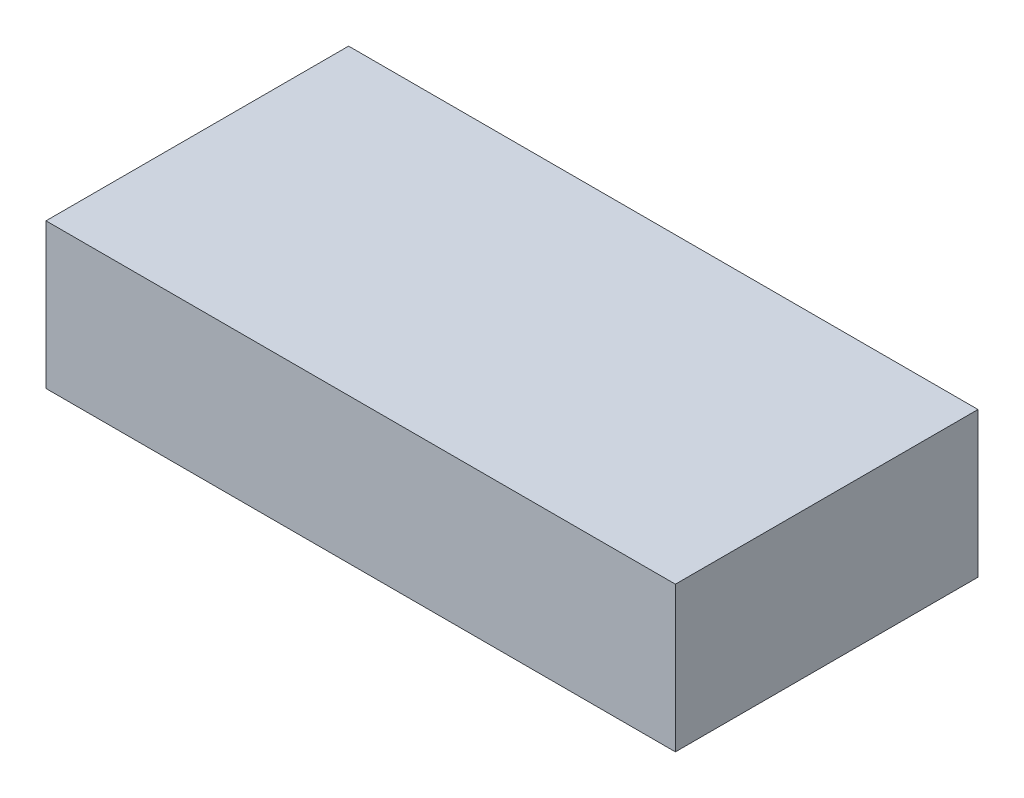
ISO-10303-21;
HEADER;
FILE_DESCRIPTION(('STEP AP214'),'2;1');
FILE_NAME('part.step','',(''),(''),'','','');
FILE_SCHEMA(('AUTOMOTIVE_DESIGN { 1 0 10303 214 1 1 1 1 }'));
ENDSEC;
DATA;
#1=APPLICATION_CONTEXT('core data for automotive mechanical design processes');
#2=APPLICATION_PROTOCOL_DEFINITION('international standard','automotive_design',2000,#1);
#3=PRODUCT_CONTEXT('',#1,'mechanical');
#4=PRODUCT('Part','Part','',(#3));
#5=PRODUCT_RELATED_PRODUCT_CATEGORY('part','',(#4));
#6=PRODUCT_DEFINITION_FORMATION('','',#4);
#7=PRODUCT_DEFINITION_CONTEXT('part definition',#1,'design');
#8=PRODUCT_DEFINITION('design','',#6,#7);
#9=PRODUCT_DEFINITION_SHAPE('','',#8);
#10=(LENGTH_UNIT() NAMED_UNIT(*) SI_UNIT(.MILLI.,.METRE.));
#11=(NAMED_UNIT(*) PLANE_ANGLE_UNIT() SI_UNIT($,.RADIAN.));
#12=(NAMED_UNIT(*) SI_UNIT($,.STERADIAN.) SOLID_ANGLE_UNIT());
#13=UNCERTAINTY_MEASURE_WITH_UNIT(LENGTH_MEASURE(1.E-05),#10,'distance_accuracy_value','');
#14=(GEOMETRIC_REPRESENTATION_CONTEXT(3) GLOBAL_UNCERTAINTY_ASSIGNED_CONTEXT((#13)) GLOBAL_UNIT_ASSIGNED_CONTEXT((#10,
#11,#12)) REPRESENTATION_CONTEXT('',''));
#15=CARTESIAN_POINT('',(0.,0.,0.));
#16=DIRECTION('',(0.,0.,1.));
#17=DIRECTION('',(1.,0.,0.));
#18=AXIS2_PLACEMENT_3D('',#15,#16,#17);
#19=CARTESIAN_POINT('',(26.,12.,12.5));
#20=DIRECTION('',(-1.,0.,0.));
#21=DIRECTION('',(0.,0.,1.));
#22=AXIS2_PLACEMENT_3D('',#19,#20,#21);
#23=PLANE('',#22);
#24=DIRECTION('',(0.,0.,-1.));
#25=VECTOR('',#24,1.);
#26=CARTESIAN_POINT('',(26.,0.,12.5));
#27=LINE('',#26,#25);
#28=CARTESIAN_POINT('',(26.,0.,12.5));
#29=VERTEX_POINT('',#28);
#30=CARTESIAN_POINT('',(26.,0.,-12.5));
#31=VERTEX_POINT('',#30);
#32=EDGE_CURVE('E107',#29,#31,#27,.T.);
#33=ORIENTED_EDGE('',*,*,#32,.T.);
#34=DIRECTION('',(0.,-1.,0.));
#35=VECTOR('',#34,1.);
#36=CARTESIAN_POINT('',(26.,12.,-12.5));
#37=LINE('',#36,#35);
#38=CARTESIAN_POINT('',(26.,12.,-12.5));
#39=VERTEX_POINT('',#38);
#40=EDGE_CURVE('E11',#39,#31,#37,.T.);
#41=ORIENTED_EDGE('',*,*,#40,.F.);
#42=DIRECTION('',(0.,0.,-1.));
#43=VECTOR('',#42,1.);
#44=CARTESIAN_POINT('',(26.,12.,12.5));
#45=LINE('',#44,#43);
#46=CARTESIAN_POINT('',(26.,12.,12.5));
#47=VERTEX_POINT('',#46);
#48=EDGE_CURVE('E91',#47,#39,#45,.T.);
#49=ORIENTED_EDGE('',*,*,#48,.F.);
#50=DIRECTION('',(0.,-1.,0.));
#51=VECTOR('',#50,1.);
#52=CARTESIAN_POINT('',(26.,12.,12.5));
#53=LINE('',#52,#51);
#54=EDGE_CURVE('E103',#47,#29,#53,.T.);
#55=ORIENTED_EDGE('',*,*,#54,.T.);
#56=EDGE_LOOP('',(#33,#41,#49,#55));
#57=FACE_BOUND('',#56,.T.);
#58=ADVANCED_FACE('F39',(#57),#23,.F.);
#59=CARTESIAN_POINT('',(-26.,12.,-12.5));
#60=DIRECTION('',(0.,0.,1.));
#61=DIRECTION('',(1.,0.,0.));
#62=AXIS2_PLACEMENT_3D('',#59,#60,#61);
#63=PLANE('',#62);
#64=DIRECTION('',(-1.,0.,0.));
#65=VECTOR('',#64,1.);
#66=CARTESIAN_POINT('',(-26.,0.,-12.5));
#67=LINE('',#66,#65);
#68=CARTESIAN_POINT('',(-26.,0.,-12.5));
#69=VERTEX_POINT('',#68);
#70=EDGE_CURVE('E96',#31,#69,#67,.T.);
#71=ORIENTED_EDGE('',*,*,#70,.T.);
#72=DIRECTION('',(0.,-1.,0.));
#73=VECTOR('',#72,1.);
#74=CARTESIAN_POINT('',(-26.,12.,-12.5));
#75=LINE('',#74,#73);
#76=CARTESIAN_POINT('',(-26.,12.,-12.5));
#77=VERTEX_POINT('',#76);
#78=EDGE_CURVE('E48',#77,#69,#75,.T.);
#79=ORIENTED_EDGE('',*,*,#78,.F.);
#80=DIRECTION('',(-1.,0.,0.));
#81=VECTOR('',#80,1.);
#82=CARTESIAN_POINT('',(-26.,12.,-12.5));
#83=LINE('',#82,#81);
#84=EDGE_CURVE('E86',#39,#77,#83,.T.);
#85=ORIENTED_EDGE('',*,*,#84,.F.);
#86=ORIENTED_EDGE('',*,*,#40,.T.);
#87=EDGE_LOOP('',(#71,#79,#85,#86));
#88=FACE_BOUND('',#87,.T.);
#89=ADVANCED_FACE('F95',(#88),#63,.F.);
#90=CARTESIAN_POINT('',(-26.,12.,12.5));
#91=DIRECTION('',(1.,0.,0.));
#92=DIRECTION('',(0.,0.,-1.));
#93=AXIS2_PLACEMENT_3D('',#90,#91,#92);
#94=PLANE('',#93);
#95=DIRECTION('',(0.,0.,1.));
#96=VECTOR('',#95,1.);
#97=CARTESIAN_POINT('',(-26.,0.,12.5));
#98=LINE('',#97,#96);
#99=CARTESIAN_POINT('',(-26.,0.,12.5));
#100=VERTEX_POINT('',#99);
#101=EDGE_CURVE('E73',#69,#100,#98,.T.);
#102=ORIENTED_EDGE('',*,*,#101,.T.);
#103=DIRECTION('',(0.,-1.,0.));
#104=VECTOR('',#103,1.);
#105=CARTESIAN_POINT('',(-26.,12.,12.5));
#106=LINE('',#105,#104);
#107=CARTESIAN_POINT('',(-26.,12.,12.5));
#108=VERTEX_POINT('',#107);
#109=EDGE_CURVE('E98',#108,#100,#106,.T.);
#110=ORIENTED_EDGE('',*,*,#109,.F.);
#111=DIRECTION('',(0.,0.,1.));
#112=VECTOR('',#111,1.);
#113=CARTESIAN_POINT('',(-26.,12.,12.5));
#114=LINE('',#113,#112);
#115=EDGE_CURVE('E89',#77,#108,#114,.T.);
#116=ORIENTED_EDGE('',*,*,#115,.F.);
#117=ORIENTED_EDGE('',*,*,#78,.T.);
#118=EDGE_LOOP('',(#102,#110,#116,#117));
#119=FACE_BOUND('',#118,.T.);
#120=ADVANCED_FACE('F99',(#119),#94,.F.);
#121=CARTESIAN_POINT('',(-26.,12.,12.5));
#122=DIRECTION('',(0.,0.,-1.));
#123=DIRECTION('',(-1.,0.,0.));
#124=AXIS2_PLACEMENT_3D('',#121,#122,#123);
#125=PLANE('',#124);
#126=DIRECTION('',(1.,0.,0.));
#127=VECTOR('',#126,1.);
#128=CARTESIAN_POINT('',(-26.,0.,12.5));
#129=LINE('',#128,#127);
#130=EDGE_CURVE('E79',#100,#29,#129,.T.);
#131=ORIENTED_EDGE('',*,*,#130,.T.);
#132=ORIENTED_EDGE('',*,*,#54,.F.);
#133=DIRECTION('',(1.,0.,0.));
#134=VECTOR('',#133,1.);
#135=CARTESIAN_POINT('',(-26.,12.,12.5));
#136=LINE('',#135,#134);
#137=EDGE_CURVE('E56',#108,#47,#136,.T.);
#138=ORIENTED_EDGE('',*,*,#137,.F.);
#139=ORIENTED_EDGE('',*,*,#109,.T.);
#140=EDGE_LOOP('',(#131,#132,#138,#139));
#141=FACE_BOUND('',#140,.T.);
#142=ADVANCED_FACE('F120',(#141),#125,.F.);
#143=CARTESIAN_POINT('',(0.,12.,0.));
#144=DIRECTION('',(0.,-1.,0.));
#145=DIRECTION('',(0.,0.,-1.));
#146=AXIS2_PLACEMENT_3D('',#143,#144,#145);
#147=PLANE('',#146);
#148=ORIENTED_EDGE('',*,*,#48,.T.);
#149=ORIENTED_EDGE('',*,*,#84,.T.);
#150=ORIENTED_EDGE('',*,*,#115,.T.);
#151=ORIENTED_EDGE('',*,*,#137,.T.);
#152=EDGE_LOOP('',(#148,#149,#150,#151));
#153=FACE_BOUND('',#152,.T.);
#154=ADVANCED_FACE('F87',(#153),#147,.F.);
#155=CARTESIAN_POINT('',(0.,0.,0.));
#156=DIRECTION('',(0.,-1.,0.));
#157=DIRECTION('',(0.,0.,-1.));
#158=AXIS2_PLACEMENT_3D('',#155,#156,#157);
#159=PLANE('',#158);
#160=ORIENTED_EDGE('',*,*,#32,.F.);
#161=ORIENTED_EDGE('',*,*,#130,.F.);
#162=ORIENTED_EDGE('',*,*,#101,.F.);
#163=ORIENTED_EDGE('',*,*,#70,.F.);
#164=EDGE_LOOP('',(#160,#161,#162,#163));
#165=FACE_BOUND('',#164,.T.);
#166=ADVANCED_FACE('F123',(#165),#159,.T.);
#167=CLOSED_SHELL('',(#58,#89,#120,#142,#154,#166));
#168=MANIFOLD_SOLID_BREP('B2',#167);
#169=ADVANCED_BREP_SHAPE_REPRESENTATION('',(#18,#168),#14);
#170=SHAPE_DEFINITION_REPRESENTATION(#9,#169);
ENDSEC;
END-ISO-10303-21;
